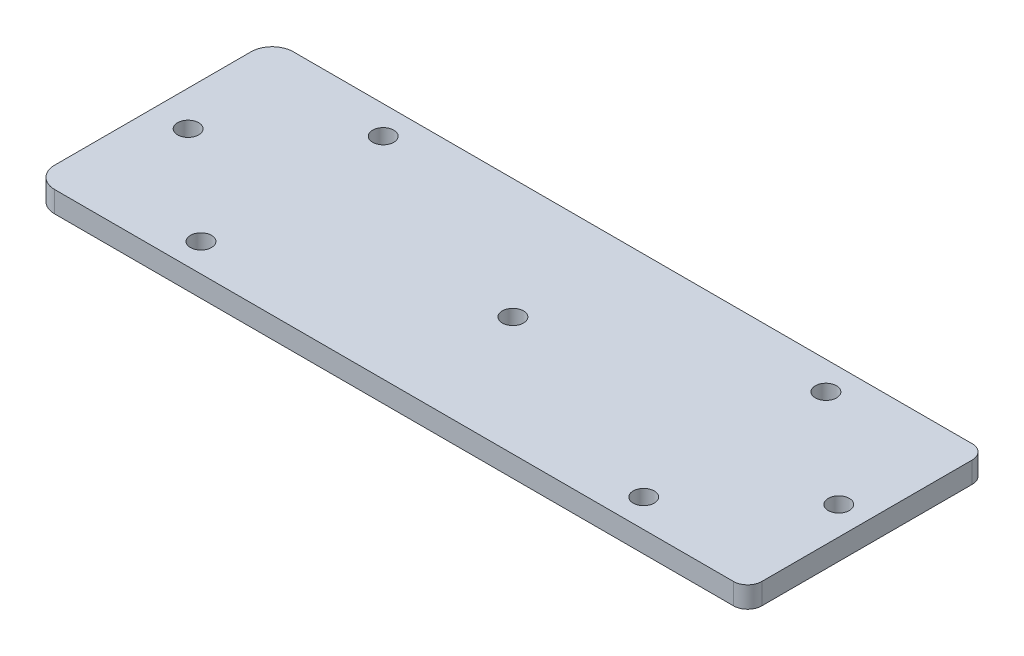
ISO-10303-21;
HEADER;
FILE_DESCRIPTION(('STEP AP214'),'2;1');
FILE_NAME('part.step','',(''),(''),'','','');
FILE_SCHEMA(('AUTOMOTIVE_DESIGN { 1 0 10303 214 1 1 1 1 }'));
ENDSEC;
DATA;
#1=APPLICATION_CONTEXT('core data for automotive mechanical design processes');
#2=APPLICATION_PROTOCOL_DEFINITION('international standard','automotive_design',2000,#1);
#3=PRODUCT_CONTEXT('',#1,'mechanical');
#4=PRODUCT('Part','Part','',(#3));
#5=PRODUCT_RELATED_PRODUCT_CATEGORY('part','',(#4));
#6=PRODUCT_DEFINITION_FORMATION('','',#4);
#7=PRODUCT_DEFINITION_CONTEXT('part definition',#1,'design');
#8=PRODUCT_DEFINITION('design','',#6,#7);
#9=PRODUCT_DEFINITION_SHAPE('','',#8);
#10=(LENGTH_UNIT() NAMED_UNIT(*) SI_UNIT(.MILLI.,.METRE.));
#11=(NAMED_UNIT(*) PLANE_ANGLE_UNIT() SI_UNIT($,.RADIAN.));
#12=(NAMED_UNIT(*) SI_UNIT($,.STERADIAN.) SOLID_ANGLE_UNIT());
#13=UNCERTAINTY_MEASURE_WITH_UNIT(LENGTH_MEASURE(1.E-05),#10,'distance_accuracy_value','');
#14=(GEOMETRIC_REPRESENTATION_CONTEXT(3) GLOBAL_UNCERTAINTY_ASSIGNED_CONTEXT((#13)) GLOBAL_UNIT_ASSIGNED_CONTEXT((#10,
#11,#12)) REPRESENTATION_CONTEXT('',''));
#15=CARTESIAN_POINT('',(0.,0.,0.));
#16=DIRECTION('',(0.,0.,1.));
#17=DIRECTION('',(1.,0.,0.));
#18=AXIS2_PLACEMENT_3D('',#15,#16,#17);
#19=CARTESIAN_POINT('',(-53.5788437202737,3.,-15.2138790696247));
#20=DIRECTION('',(0.,1.,0.));
#21=DIRECTION('',(0.,0.,1.));
#22=AXIS2_PLACEMENT_3D('',#19,#20,#21);
#23=PLANE('',#22);
#24=CARTESIAN_POINT('',(-5.42884372027375,3.,-1.21154658100969));
#25=DIRECTION('',(0.,1.,0.));
#26=DIRECTION('',(0.,0.,1.));
#27=AXIS2_PLACEMENT_3D('',#24,#25,#26);
#28=CIRCLE('',#27,1.5);
#29=CARTESIAN_POINT('',(-5.42884372027375,3.,0.288453418990312));
#30=VERTEX_POINT('',#29);
#31=EDGE_CURVE('E249',#30,#30,#28,.T.);
#32=ORIENTED_EDGE('',*,*,#31,.F.);
#33=EDGE_LOOP('',(#32));
#34=FACE_BOUND('',#33,.T.);
#35=CARTESIAN_POINT('',(-51.5788437202737,3.,-1.28887906962472));
#36=DIRECTION('',(0.,1.,0.));
#37=DIRECTION('',(0.,0.,1.));
#38=AXIS2_PLACEMENT_3D('',#35,#36,#37);
#39=CIRCLE('',#38,1.5);
#40=CARTESIAN_POINT('',(-51.5788437202737,3.,0.211120930375289));
#41=VERTEX_POINT('',#40);
#42=EDGE_CURVE('E233',#41,#41,#39,.T.);
#43=ORIENTED_EDGE('',*,*,#42,.F.);
#44=EDGE_LOOP('',(#43));
#45=FACE_BOUND('',#44,.T.);
#46=CARTESIAN_POINT('',(25.9711562797262,3.,-14.2138790696247));
#47=DIRECTION('',(0.,1.,0.));
#48=DIRECTION('',(0.,0.,1.));
#49=AXIS2_PLACEMENT_3D('',#46,#47,#48);
#50=CIRCLE('',#49,1.5);
#51=CARTESIAN_POINT('',(25.9711562797262,3.,-12.7138790696247));
#52=VERTEX_POINT('',#51);
#53=EDGE_CURVE('E217',#52,#52,#50,.T.);
#54=ORIENTED_EDGE('',*,*,#53,.F.);
#55=EDGE_LOOP('',(#54));
#56=FACE_BOUND('',#55,.T.);
#57=CARTESIAN_POINT('',(-53.5788437202737,3.,-15.2138790696247));
#58=DIRECTION('',(0.,1.,0.));
#59=DIRECTION('',(0.,0.,1.));
#60=AXIS2_PLACEMENT_3D('',#57,#58,#59);
#61=CIRCLE('',#60,3.);
#62=CARTESIAN_POINT('',(-53.5788437202737,3.,-18.2138790696247));
#63=VERTEX_POINT('',#62);
#64=CARTESIAN_POINT('',(-56.5788437202737,3.,-15.2138790696247));
#65=VERTEX_POINT('',#64);
#66=EDGE_CURVE('E168',#63,#65,#61,.T.);
#67=ORIENTED_EDGE('',*,*,#66,.T.);
#68=DIRECTION('',(0.,0.,1.));
#69=VECTOR('',#68,1.);
#70=CARTESIAN_POINT('',(-56.5788437202737,3.,-15.2138790696247));
#71=LINE('',#70,#69);
#72=CARTESIAN_POINT('',(-56.5788437202737,3.,12.6361209303753));
#73=VERTEX_POINT('',#72);
#74=EDGE_CURVE('E104',#65,#73,#71,.T.);
#75=ORIENTED_EDGE('',*,*,#74,.T.);
#76=CARTESIAN_POINT('',(-53.5788437202737,3.,12.6361209303753));
#77=DIRECTION('',(0.,1.,0.));
#78=DIRECTION('',(0.,0.,1.));
#79=AXIS2_PLACEMENT_3D('',#76,#77,#78);
#80=CIRCLE('',#79,3.);
#81=CARTESIAN_POINT('',(-53.5788437202737,3.,15.6361209303753));
#82=VERTEX_POINT('',#81);
#83=EDGE_CURVE('E189',#73,#82,#80,.T.);
#84=ORIENTED_EDGE('',*,*,#83,.T.);
#85=DIRECTION('',(1.,0.,0.));
#86=VECTOR('',#85,1.);
#87=CARTESIAN_POINT('',(-53.5788437202737,3.,15.6361209303753));
#88=LINE('',#87,#86);
#89=CARTESIAN_POINT('',(42.7211562797262,3.,15.6361209303753));
#90=VERTEX_POINT('',#89);
#91=EDGE_CURVE('E203',#82,#90,#88,.T.);
#92=ORIENTED_EDGE('',*,*,#91,.T.);
#93=CARTESIAN_POINT('',(42.7211562797262,3.,13.6361209303753));
#94=DIRECTION('',(0.,1.,0.));
#95=DIRECTION('',(0.,0.,1.));
#96=AXIS2_PLACEMENT_3D('',#93,#94,#95);
#97=CIRCLE('',#96,2.);
#98=CARTESIAN_POINT('',(44.7211562797262,3.,13.6361209303753));
#99=VERTEX_POINT('',#98);
#100=EDGE_CURVE('E123',#90,#99,#97,.T.);
#101=ORIENTED_EDGE('',*,*,#100,.T.);
#102=DIRECTION('',(0.,0.,-1.));
#103=VECTOR('',#102,1.);
#104=CARTESIAN_POINT('',(44.7211562797262,3.,13.6361209303753));
#105=LINE('',#104,#103);
#106=CARTESIAN_POINT('',(44.7211562797262,3.,-16.2138790696247));
#107=VERTEX_POINT('',#106);
#108=EDGE_CURVE('E117',#99,#107,#105,.T.);
#109=ORIENTED_EDGE('',*,*,#108,.T.);
#110=CARTESIAN_POINT('',(42.7211562797262,3.,-16.2138790696247));
#111=DIRECTION('',(0.,1.,0.));
#112=DIRECTION('',(0.,0.,1.));
#113=AXIS2_PLACEMENT_3D('',#110,#111,#112);
#114=CIRCLE('',#113,2.);
#115=CARTESIAN_POINT('',(42.7211562797262,3.,-18.2138790696247));
#116=VERTEX_POINT('',#115);
#117=EDGE_CURVE('E121',#107,#116,#114,.T.);
#118=ORIENTED_EDGE('',*,*,#117,.T.);
#119=DIRECTION('',(-1.,0.,0.));
#120=VECTOR('',#119,1.);
#121=CARTESIAN_POINT('',(42.7211562797262,3.,-18.2138790696247));
#122=LINE('',#121,#120);
#123=EDGE_CURVE('E61',#116,#63,#122,.T.);
#124=ORIENTED_EDGE('',*,*,#123,.T.);
#125=EDGE_LOOP('',(#67,#75,#84,#92,#101,#109,#118,#124));
#126=FACE_BOUND('',#125,.T.);
#127=CARTESIAN_POINT('',(40.7211562797263,3.,-1.28887906962472));
#128=DIRECTION('',(0.,1.,0.));
#129=DIRECTION('',(0.,0.,1.));
#130=AXIS2_PLACEMENT_3D('',#127,#128,#129);
#131=CIRCLE('',#130,1.5);
#132=CARTESIAN_POINT('',(40.7211562797263,3.,0.211120930375289));
#133=VERTEX_POINT('',#132);
#134=EDGE_CURVE('E150',#133,#133,#131,.T.);
#135=ORIENTED_EDGE('',*,*,#134,.F.);
#136=EDGE_LOOP('',(#135));
#137=FACE_BOUND('',#136,.T.);
#138=CARTESIAN_POINT('',(-36.8288437202737,3.,-14.2138790696247));
#139=DIRECTION('',(0.,1.,0.));
#140=DIRECTION('',(0.,0.,1.));
#141=AXIS2_PLACEMENT_3D('',#138,#139,#140);
#142=CIRCLE('',#141,1.5);
#143=CARTESIAN_POINT('',(-36.8288437202737,3.,-12.7138790696247));
#144=VERTEX_POINT('',#143);
#145=EDGE_CURVE('E225',#144,#144,#142,.T.);
#146=ORIENTED_EDGE('',*,*,#145,.F.);
#147=EDGE_LOOP('',(#146));
#148=FACE_BOUND('',#147,.T.);
#149=CARTESIAN_POINT('',(-36.8288437202737,3.,11.6361209303753));
#150=DIRECTION('',(0.,1.,0.));
#151=DIRECTION('',(0.,0.,1.));
#152=AXIS2_PLACEMENT_3D('',#149,#150,#151);
#153=CIRCLE('',#152,1.5);
#154=CARTESIAN_POINT('',(-36.8288437202737,3.,13.1361209303753));
#155=VERTEX_POINT('',#154);
#156=EDGE_CURVE('E241',#155,#155,#153,.T.);
#157=ORIENTED_EDGE('',*,*,#156,.F.);
#158=EDGE_LOOP('',(#157));
#159=FACE_BOUND('',#158,.T.);
#160=CARTESIAN_POINT('',(25.9711562797263,3.,11.6361209303753));
#161=DIRECTION('',(0.,1.,0.));
#162=DIRECTION('',(0.,0.,1.));
#163=AXIS2_PLACEMENT_3D('',#160,#161,#162);
#164=CIRCLE('',#163,1.5);
#165=CARTESIAN_POINT('',(25.9711562797263,3.,13.1361209303753));
#166=VERTEX_POINT('',#165);
#167=EDGE_CURVE('E257',#166,#166,#164,.T.);
#168=ORIENTED_EDGE('',*,*,#167,.F.);
#169=EDGE_LOOP('',(#168));
#170=FACE_BOUND('',#169,.T.);
#171=ADVANCED_FACE('F43',(#34,#45,#56,#126,#137,#148,#159,#170),#23,.T.);
#172=CARTESIAN_POINT('',(-53.5788437202737,0.,-15.2138790696247));
#173=DIRECTION('',(0.,1.,0.));
#174=DIRECTION('',(0.,0.,1.));
#175=AXIS2_PLACEMENT_3D('',#172,#173,#174);
#176=PLANE('',#175);
#177=CARTESIAN_POINT('',(-53.5788437202737,0.,-15.2138790696247));
#178=DIRECTION('',(0.,1.,0.));
#179=DIRECTION('',(0.,0.,1.));
#180=AXIS2_PLACEMENT_3D('',#177,#178,#179);
#181=CIRCLE('',#180,3.);
#182=CARTESIAN_POINT('',(-53.5788437202737,0.,-18.2138790696247));
#183=VERTEX_POINT('',#182);
#184=CARTESIAN_POINT('',(-56.5788437202737,0.,-15.2138790696247));
#185=VERTEX_POINT('',#184);
#186=EDGE_CURVE('E145',#183,#185,#181,.T.);
#187=ORIENTED_EDGE('',*,*,#186,.F.);
#188=DIRECTION('',(-1.,0.,0.));
#189=VECTOR('',#188,1.);
#190=CARTESIAN_POINT('',(42.7211562797262,0.,-18.2138790696247));
#191=LINE('',#190,#189);
#192=CARTESIAN_POINT('',(42.7211562797262,0.,-18.2138790696247));
#193=VERTEX_POINT('',#192);
#194=EDGE_CURVE('E96',#193,#183,#191,.T.);
#195=ORIENTED_EDGE('',*,*,#194,.F.);
#196=CARTESIAN_POINT('',(42.7211562797262,0.,-16.2138790696247));
#197=DIRECTION('',(0.,1.,0.));
#198=DIRECTION('',(0.,0.,1.));
#199=AXIS2_PLACEMENT_3D('',#196,#197,#198);
#200=CIRCLE('',#199,2.);
#201=CARTESIAN_POINT('',(44.7211562797262,0.,-16.2138790696247));
#202=VERTEX_POINT('',#201);
#203=EDGE_CURVE('E90',#202,#193,#200,.T.);
#204=ORIENTED_EDGE('',*,*,#203,.F.);
#205=DIRECTION('',(0.,0.,-1.));
#206=VECTOR('',#205,1.);
#207=CARTESIAN_POINT('',(44.7211562797262,0.,13.6361209303753));
#208=LINE('',#207,#206);
#209=CARTESIAN_POINT('',(44.7211562797262,0.,13.6361209303753));
#210=VERTEX_POINT('',#209);
#211=EDGE_CURVE('E132',#210,#202,#208,.T.);
#212=ORIENTED_EDGE('',*,*,#211,.F.);
#213=CARTESIAN_POINT('',(42.7211562797262,0.,13.6361209303753));
#214=DIRECTION('',(0.,1.,0.));
#215=DIRECTION('',(0.,0.,1.));
#216=AXIS2_PLACEMENT_3D('',#213,#214,#215);
#217=CIRCLE('',#216,2.);
#218=CARTESIAN_POINT('',(42.7211562797262,0.,15.6361209303753));
#219=VERTEX_POINT('',#218);
#220=EDGE_CURVE('E159',#219,#210,#217,.T.);
#221=ORIENTED_EDGE('',*,*,#220,.F.);
#222=DIRECTION('',(1.,0.,0.));
#223=VECTOR('',#222,1.);
#224=CARTESIAN_POINT('',(-53.5788437202737,0.,15.6361209303753));
#225=LINE('',#224,#223);
#226=CARTESIAN_POINT('',(-53.5788437202737,0.,15.6361209303753));
#227=VERTEX_POINT('',#226);
#228=EDGE_CURVE('E156',#227,#219,#225,.T.);
#229=ORIENTED_EDGE('',*,*,#228,.F.);
#230=CARTESIAN_POINT('',(-53.5788437202737,0.,12.6361209303753));
#231=DIRECTION('',(0.,1.,0.));
#232=DIRECTION('',(0.,0.,1.));
#233=AXIS2_PLACEMENT_3D('',#230,#231,#232);
#234=CIRCLE('',#233,3.);
#235=CARTESIAN_POINT('',(-56.5788437202737,0.,12.6361209303753));
#236=VERTEX_POINT('',#235);
#237=EDGE_CURVE('E153',#236,#227,#234,.T.);
#238=ORIENTED_EDGE('',*,*,#237,.F.);
#239=DIRECTION('',(0.,0.,1.));
#240=VECTOR('',#239,1.);
#241=CARTESIAN_POINT('',(-56.5788437202737,0.,-15.2138790696247));
#242=LINE('',#241,#240);
#243=EDGE_CURVE('E149',#185,#236,#242,.T.);
#244=ORIENTED_EDGE('',*,*,#243,.F.);
#245=EDGE_LOOP('',(#187,#195,#204,#212,#221,#229,#238,#244));
#246=FACE_BOUND('',#245,.T.);
#247=CARTESIAN_POINT('',(40.7211562797263,0.,-1.28887906962472));
#248=DIRECTION('',(0.,1.,0.));
#249=DIRECTION('',(0.,0.,1.));
#250=AXIS2_PLACEMENT_3D('',#247,#248,#249);
#251=CIRCLE('',#250,1.5);
#252=CARTESIAN_POINT('',(40.7211562797263,0.,0.211120930375289));
#253=VERTEX_POINT('',#252);
#254=EDGE_CURVE('E213',#253,#253,#251,.T.);
#255=ORIENTED_EDGE('',*,*,#254,.T.);
#256=EDGE_LOOP('',(#255));
#257=FACE_BOUND('',#256,.T.);
#258=CARTESIAN_POINT('',(25.9711562797262,0.,-14.2138790696247));
#259=DIRECTION('',(0.,1.,0.));
#260=DIRECTION('',(0.,0.,1.));
#261=AXIS2_PLACEMENT_3D('',#258,#259,#260);
#262=CIRCLE('',#261,1.5);
#263=CARTESIAN_POINT('',(25.9711562797262,0.,-12.7138790696247));
#264=VERTEX_POINT('',#263);
#265=EDGE_CURVE('E221',#264,#264,#262,.T.);
#266=ORIENTED_EDGE('',*,*,#265,.T.);
#267=EDGE_LOOP('',(#266));
#268=FACE_BOUND('',#267,.T.);
#269=CARTESIAN_POINT('',(-36.8288437202737,0.,-14.2138790696247));
#270=DIRECTION('',(0.,1.,0.));
#271=DIRECTION('',(0.,0.,1.));
#272=AXIS2_PLACEMENT_3D('',#269,#270,#271);
#273=CIRCLE('',#272,1.5);
#274=CARTESIAN_POINT('',(-36.8288437202737,0.,-12.7138790696247));
#275=VERTEX_POINT('',#274);
#276=EDGE_CURVE('E229',#275,#275,#273,.T.);
#277=ORIENTED_EDGE('',*,*,#276,.T.);
#278=EDGE_LOOP('',(#277));
#279=FACE_BOUND('',#278,.T.);
#280=CARTESIAN_POINT('',(-51.5788437202737,0.,-1.28887906962472));
#281=DIRECTION('',(0.,1.,0.));
#282=DIRECTION('',(0.,0.,1.));
#283=AXIS2_PLACEMENT_3D('',#280,#281,#282);
#284=CIRCLE('',#283,1.5);
#285=CARTESIAN_POINT('',(-51.5788437202737,0.,0.211120930375289));
#286=VERTEX_POINT('',#285);
#287=EDGE_CURVE('E237',#286,#286,#284,.T.);
#288=ORIENTED_EDGE('',*,*,#287,.T.);
#289=EDGE_LOOP('',(#288));
#290=FACE_BOUND('',#289,.T.);
#291=CARTESIAN_POINT('',(-36.8288437202737,0.,11.6361209303753));
#292=DIRECTION('',(0.,1.,0.));
#293=DIRECTION('',(0.,0.,1.));
#294=AXIS2_PLACEMENT_3D('',#291,#292,#293);
#295=CIRCLE('',#294,1.5);
#296=CARTESIAN_POINT('',(-36.8288437202737,0.,13.1361209303753));
#297=VERTEX_POINT('',#296);
#298=EDGE_CURVE('E245',#297,#297,#295,.T.);
#299=ORIENTED_EDGE('',*,*,#298,.T.);
#300=EDGE_LOOP('',(#299));
#301=FACE_BOUND('',#300,.T.);
#302=CARTESIAN_POINT('',(-5.42884372027375,0.,-1.21154658100969));
#303=DIRECTION('',(0.,1.,0.));
#304=DIRECTION('',(0.,0.,1.));
#305=AXIS2_PLACEMENT_3D('',#302,#303,#304);
#306=CIRCLE('',#305,1.5);
#307=CARTESIAN_POINT('',(-5.42884372027375,0.,0.288453418990312));
#308=VERTEX_POINT('',#307);
#309=EDGE_CURVE('E253',#308,#308,#306,.T.);
#310=ORIENTED_EDGE('',*,*,#309,.T.);
#311=EDGE_LOOP('',(#310));
#312=FACE_BOUND('',#311,.T.);
#313=CARTESIAN_POINT('',(25.9711562797263,0.,11.6361209303753));
#314=DIRECTION('',(0.,1.,0.));
#315=DIRECTION('',(0.,0.,1.));
#316=AXIS2_PLACEMENT_3D('',#313,#314,#315);
#317=CIRCLE('',#316,1.5);
#318=CARTESIAN_POINT('',(25.9711562797263,0.,13.1361209303753));
#319=VERTEX_POINT('',#318);
#320=EDGE_CURVE('E261',#319,#319,#317,.T.);
#321=ORIENTED_EDGE('',*,*,#320,.T.);
#322=EDGE_LOOP('',(#321));
#323=FACE_BOUND('',#322,.T.);
#324=ADVANCED_FACE('F193',(#246,#257,#268,#279,#290,#301,#312,#323),#176,.F.);
#325=CARTESIAN_POINT('',(-53.5788437202737,3.,-15.2138790696247));
#326=DIRECTION('',(0.,-1.,0.));
#327=DIRECTION('',(0.,0.,-1.));
#328=AXIS2_PLACEMENT_3D('',#325,#326,#327);
#329=CYLINDRICAL_SURFACE('',#328,3.);
#330=ORIENTED_EDGE('',*,*,#186,.T.);
#331=DIRECTION('',(0.,-1.,0.));
#332=VECTOR('',#331,1.);
#333=CARTESIAN_POINT('',(-56.5788437202737,3.,-15.2138790696247));
#334=LINE('',#333,#332);
#335=EDGE_CURVE('E11',#65,#185,#334,.T.);
#336=ORIENTED_EDGE('',*,*,#335,.F.);
#337=ORIENTED_EDGE('',*,*,#66,.F.);
#338=DIRECTION('',(0.,-1.,0.));
#339=VECTOR('',#338,1.);
#340=CARTESIAN_POINT('',(-53.5788437202737,3.,-18.2138790696247));
#341=LINE('',#340,#339);
#342=EDGE_CURVE('E141',#63,#183,#341,.T.);
#343=ORIENTED_EDGE('',*,*,#342,.T.);
#344=EDGE_LOOP('',(#330,#336,#337,#343));
#345=FACE_BOUND('',#344,.T.);
#346=ADVANCED_FACE('F45',(#345),#329,.T.);
#347=CARTESIAN_POINT('',(-56.5788437202737,3.,-15.2138790696247));
#348=DIRECTION('',(1.,0.,0.));
#349=DIRECTION('',(0.,0.,-1.));
#350=AXIS2_PLACEMENT_3D('',#347,#348,#349);
#351=PLANE('',#350);
#352=ORIENTED_EDGE('',*,*,#243,.T.);
#353=DIRECTION('',(0.,-1.,0.));
#354=VECTOR('',#353,1.);
#355=CARTESIAN_POINT('',(-56.5788437202737,3.,12.6361209303753));
#356=LINE('',#355,#354);
#357=EDGE_CURVE('E53',#73,#236,#356,.T.);
#358=ORIENTED_EDGE('',*,*,#357,.F.);
#359=ORIENTED_EDGE('',*,*,#74,.F.);
#360=ORIENTED_EDGE('',*,*,#335,.T.);
#361=EDGE_LOOP('',(#352,#358,#359,#360));
#362=FACE_BOUND('',#361,.T.);
#363=ADVANCED_FACE('F297',(#362),#351,.F.);
#364=CARTESIAN_POINT('',(-53.5788437202737,3.,12.6361209303753));
#365=DIRECTION('',(0.,-1.,0.));
#366=DIRECTION('',(0.,0.,-1.));
#367=AXIS2_PLACEMENT_3D('',#364,#365,#366);
#368=CYLINDRICAL_SURFACE('',#367,3.);
#369=ORIENTED_EDGE('',*,*,#237,.T.);
#370=DIRECTION('',(0.,-1.,0.));
#371=VECTOR('',#370,1.);
#372=CARTESIAN_POINT('',(-53.5788437202737,3.,15.6361209303753));
#373=LINE('',#372,#371);
#374=EDGE_CURVE('E179',#82,#227,#373,.T.);
#375=ORIENTED_EDGE('',*,*,#374,.F.);
#376=ORIENTED_EDGE('',*,*,#83,.F.);
#377=ORIENTED_EDGE('',*,*,#357,.T.);
#378=EDGE_LOOP('',(#369,#375,#376,#377));
#379=FACE_BOUND('',#378,.T.);
#380=ADVANCED_FACE('F187',(#379),#368,.T.);
#381=CARTESIAN_POINT('',(-53.5788437202737,3.,15.6361209303753));
#382=DIRECTION('',(0.,0.,-1.));
#383=DIRECTION('',(-1.,0.,0.));
#384=AXIS2_PLACEMENT_3D('',#381,#382,#383);
#385=PLANE('',#384);
#386=ORIENTED_EDGE('',*,*,#228,.T.);
#387=DIRECTION('',(0.,-1.,0.));
#388=VECTOR('',#387,1.);
#389=CARTESIAN_POINT('',(42.7211562797262,3.,15.6361209303753));
#390=LINE('',#389,#388);
#391=EDGE_CURVE('E175',#90,#219,#390,.T.);
#392=ORIENTED_EDGE('',*,*,#391,.F.);
#393=ORIENTED_EDGE('',*,*,#91,.F.);
#394=ORIENTED_EDGE('',*,*,#374,.T.);
#395=EDGE_LOOP('',(#386,#392,#393,#394));
#396=FACE_BOUND('',#395,.T.);
#397=ADVANCED_FACE('F198',(#396),#385,.F.);
#398=CARTESIAN_POINT('',(42.7211562797262,3.,13.6361209303753));
#399=DIRECTION('',(0.,-1.,0.));
#400=DIRECTION('',(0.,0.,-1.));
#401=AXIS2_PLACEMENT_3D('',#398,#399,#400);
#402=CYLINDRICAL_SURFACE('',#401,2.);
#403=ORIENTED_EDGE('',*,*,#220,.T.);
#404=DIRECTION('',(0.,-1.,0.));
#405=VECTOR('',#404,1.);
#406=CARTESIAN_POINT('',(44.7211562797262,3.,13.6361209303753));
#407=LINE('',#406,#405);
#408=EDGE_CURVE('E134',#99,#210,#407,.T.);
#409=ORIENTED_EDGE('',*,*,#408,.F.);
#410=ORIENTED_EDGE('',*,*,#100,.F.);
#411=ORIENTED_EDGE('',*,*,#391,.T.);
#412=EDGE_LOOP('',(#403,#409,#410,#411));
#413=FACE_BOUND('',#412,.T.);
#414=ADVANCED_FACE('F201',(#413),#402,.T.);
#415=CARTESIAN_POINT('',(44.7211562797262,3.,13.6361209303753));
#416=DIRECTION('',(-1.,0.,0.));
#417=DIRECTION('',(0.,0.,1.));
#418=AXIS2_PLACEMENT_3D('',#415,#416,#417);
#419=PLANE('',#418);
#420=ORIENTED_EDGE('',*,*,#211,.T.);
#421=DIRECTION('',(0.,-1.,0.));
#422=VECTOR('',#421,1.);
#423=CARTESIAN_POINT('',(44.7211562797262,3.,-16.2138790696247));
#424=LINE('',#423,#422);
#425=EDGE_CURVE('E129',#107,#202,#424,.T.);
#426=ORIENTED_EDGE('',*,*,#425,.F.);
#427=ORIENTED_EDGE('',*,*,#108,.F.);
#428=ORIENTED_EDGE('',*,*,#408,.T.);
#429=EDGE_LOOP('',(#420,#426,#427,#428));
#430=FACE_BOUND('',#429,.T.);
#431=ADVANCED_FACE('F130',(#430),#419,.F.);
#432=CARTESIAN_POINT('',(42.7211562797262,3.,-16.2138790696247));
#433=DIRECTION('',(0.,-1.,0.));
#434=DIRECTION('',(0.,0.,-1.));
#435=AXIS2_PLACEMENT_3D('',#432,#433,#434);
#436=CYLINDRICAL_SURFACE('',#435,2.);
#437=ORIENTED_EDGE('',*,*,#203,.T.);
#438=DIRECTION('',(0.,-1.,0.));
#439=VECTOR('',#438,1.);
#440=CARTESIAN_POINT('',(42.7211562797262,3.,-18.2138790696247));
#441=LINE('',#440,#439);
#442=EDGE_CURVE('E135',#116,#193,#441,.T.);
#443=ORIENTED_EDGE('',*,*,#442,.F.);
#444=ORIENTED_EDGE('',*,*,#117,.F.);
#445=ORIENTED_EDGE('',*,*,#425,.T.);
#446=EDGE_LOOP('',(#437,#443,#444,#445));
#447=FACE_BOUND('',#446,.T.);
#448=ADVANCED_FACE('F137',(#447),#436,.T.);
#449=CARTESIAN_POINT('',(42.7211562797262,3.,-18.2138790696247));
#450=DIRECTION('',(0.,0.,1.));
#451=DIRECTION('',(1.,0.,0.));
#452=AXIS2_PLACEMENT_3D('',#449,#450,#451);
#453=PLANE('',#452);
#454=ORIENTED_EDGE('',*,*,#194,.T.);
#455=ORIENTED_EDGE('',*,*,#342,.F.);
#456=ORIENTED_EDGE('',*,*,#123,.F.);
#457=ORIENTED_EDGE('',*,*,#442,.T.);
#458=EDGE_LOOP('',(#454,#455,#456,#457));
#459=FACE_BOUND('',#458,.T.);
#460=ADVANCED_FACE('F285',(#459),#453,.F.);
#461=CARTESIAN_POINT('',(40.7211562797263,3.,-1.28887906962472));
#462=DIRECTION('',(0.,-1.,0.));
#463=DIRECTION('',(0.,0.,-1.));
#464=AXIS2_PLACEMENT_3D('',#461,#462,#463);
#465=CYLINDRICAL_SURFACE('',#464,1.5);
#466=ORIENTED_EDGE('',*,*,#134,.T.);
#467=EDGE_LOOP('',(#466));
#468=FACE_BOUND('',#467,.T.);
#469=ORIENTED_EDGE('',*,*,#254,.F.);
#470=EDGE_LOOP('',(#469));
#471=FACE_BOUND('',#470,.T.);
#472=ADVANCED_FACE('F282',(#468,#471),#465,.F.);
#473=CARTESIAN_POINT('',(25.9711562797262,3.,-14.2138790696247));
#474=DIRECTION('',(0.,-1.,0.));
#475=DIRECTION('',(0.,0.,-1.));
#476=AXIS2_PLACEMENT_3D('',#473,#474,#475);
#477=CYLINDRICAL_SURFACE('',#476,1.5);
#478=ORIENTED_EDGE('',*,*,#53,.T.);
#479=EDGE_LOOP('',(#478));
#480=FACE_BOUND('',#479,.T.);
#481=ORIENTED_EDGE('',*,*,#265,.F.);
#482=EDGE_LOOP('',(#481));
#483=FACE_BOUND('',#482,.T.);
#484=ADVANCED_FACE('F373',(#480,#483),#477,.F.);
#485=CARTESIAN_POINT('',(-36.8288437202737,3.,-14.2138790696247));
#486=DIRECTION('',(0.,-1.,0.));
#487=DIRECTION('',(0.,0.,-1.));
#488=AXIS2_PLACEMENT_3D('',#485,#486,#487);
#489=CYLINDRICAL_SURFACE('',#488,1.5);
#490=ORIENTED_EDGE('',*,*,#145,.T.);
#491=EDGE_LOOP('',(#490));
#492=FACE_BOUND('',#491,.T.);
#493=ORIENTED_EDGE('',*,*,#276,.F.);
#494=EDGE_LOOP('',(#493));
#495=FACE_BOUND('',#494,.T.);
#496=ADVANCED_FACE('F382',(#492,#495),#489,.F.);
#497=CARTESIAN_POINT('',(-51.5788437202737,3.,-1.28887906962472));
#498=DIRECTION('',(0.,-1.,0.));
#499=DIRECTION('',(0.,0.,-1.));
#500=AXIS2_PLACEMENT_3D('',#497,#498,#499);
#501=CYLINDRICAL_SURFACE('',#500,1.5);
#502=ORIENTED_EDGE('',*,*,#42,.T.);
#503=EDGE_LOOP('',(#502));
#504=FACE_BOUND('',#503,.T.);
#505=ORIENTED_EDGE('',*,*,#287,.F.);
#506=EDGE_LOOP('',(#505));
#507=FACE_BOUND('',#506,.T.);
#508=ADVANCED_FACE('F391',(#504,#507),#501,.F.);
#509=CARTESIAN_POINT('',(-36.8288437202737,3.,11.6361209303753));
#510=DIRECTION('',(0.,-1.,0.));
#511=DIRECTION('',(0.,0.,-1.));
#512=AXIS2_PLACEMENT_3D('',#509,#510,#511);
#513=CYLINDRICAL_SURFACE('',#512,1.5);
#514=ORIENTED_EDGE('',*,*,#156,.T.);
#515=EDGE_LOOP('',(#514));
#516=FACE_BOUND('',#515,.T.);
#517=ORIENTED_EDGE('',*,*,#298,.F.);
#518=EDGE_LOOP('',(#517));
#519=FACE_BOUND('',#518,.T.);
#520=ADVANCED_FACE('F401',(#516,#519),#513,.F.);
#521=CARTESIAN_POINT('',(-5.42884372027375,3.,-1.21154658100969));
#522=DIRECTION('',(0.,-1.,0.));
#523=DIRECTION('',(0.,0.,-1.));
#524=AXIS2_PLACEMENT_3D('',#521,#522,#523);
#525=CYLINDRICAL_SURFACE('',#524,1.5);
#526=ORIENTED_EDGE('',*,*,#31,.T.);
#527=EDGE_LOOP('',(#526));
#528=FACE_BOUND('',#527,.T.);
#529=ORIENTED_EDGE('',*,*,#309,.F.);
#530=EDGE_LOOP('',(#529));
#531=FACE_BOUND('',#530,.T.);
#532=ADVANCED_FACE('F411',(#528,#531),#525,.F.);
#533=CARTESIAN_POINT('',(25.9711562797263,3.,11.6361209303753));
#534=DIRECTION('',(0.,-1.,0.));
#535=DIRECTION('',(0.,0.,-1.));
#536=AXIS2_PLACEMENT_3D('',#533,#534,#535);
#537=CYLINDRICAL_SURFACE('',#536,1.5);
#538=ORIENTED_EDGE('',*,*,#167,.T.);
#539=EDGE_LOOP('',(#538));
#540=FACE_BOUND('',#539,.T.);
#541=ORIENTED_EDGE('',*,*,#320,.F.);
#542=EDGE_LOOP('',(#541));
#543=FACE_BOUND('',#542,.T.);
#544=ADVANCED_FACE('F269',(#540,#543),#537,.F.);
#545=CLOSED_SHELL('',(#171,#324,#346,#363,#380,#397,#414,#431,#448,#460,#472,#484,#496,#508,
#520,#532,#544));
#546=MANIFOLD_SOLID_BREP('B2',#545);
#547=ADVANCED_BREP_SHAPE_REPRESENTATION('',(#18,#546),#14);
#548=SHAPE_DEFINITION_REPRESENTATION(#9,#547);
ENDSEC;
END-ISO-10303-21;
